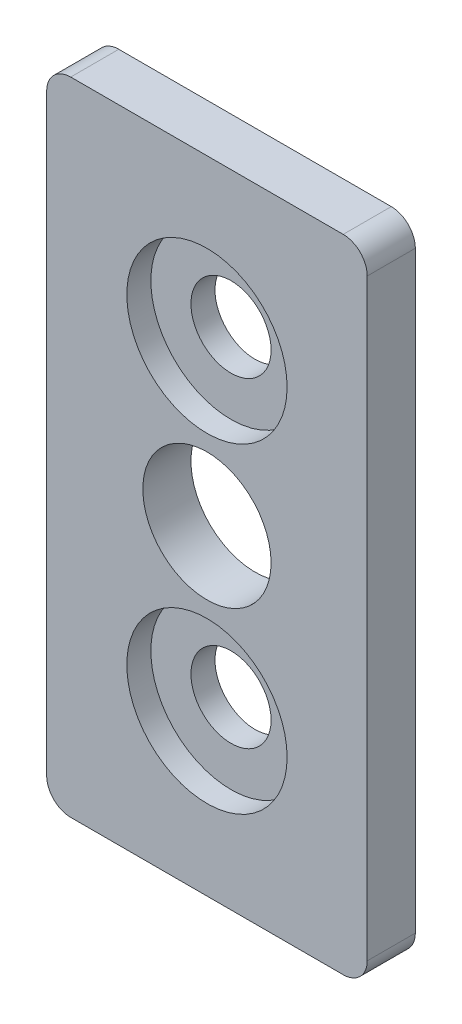
ISO-10303-21;
HEADER;
FILE_DESCRIPTION(('STEP AP214'),'2;1');
FILE_NAME('part.step','',(''),(''),'','','');
FILE_SCHEMA(('AUTOMOTIVE_DESIGN { 1 0 10303 214 1 1 1 1 }'));
ENDSEC;
DATA;
#1=APPLICATION_CONTEXT('core data for automotive mechanical design processes');
#2=APPLICATION_PROTOCOL_DEFINITION('international standard','automotive_design',2000,#1);
#3=PRODUCT_CONTEXT('',#1,'mechanical');
#4=PRODUCT('Part','Part','',(#3));
#5=PRODUCT_RELATED_PRODUCT_CATEGORY('part','',(#4));
#6=PRODUCT_DEFINITION_FORMATION('','',#4);
#7=PRODUCT_DEFINITION_CONTEXT('part definition',#1,'design');
#8=PRODUCT_DEFINITION('design','',#6,#7);
#9=PRODUCT_DEFINITION_SHAPE('','',#8);
#10=(LENGTH_UNIT() NAMED_UNIT(*) SI_UNIT(.MILLI.,.METRE.));
#11=(NAMED_UNIT(*) PLANE_ANGLE_UNIT() SI_UNIT($,.RADIAN.));
#12=(NAMED_UNIT(*) SI_UNIT($,.STERADIAN.) SOLID_ANGLE_UNIT());
#13=UNCERTAINTY_MEASURE_WITH_UNIT(LENGTH_MEASURE(1.E-05),#10,'distance_accuracy_value','');
#14=(GEOMETRIC_REPRESENTATION_CONTEXT(3) GLOBAL_UNCERTAINTY_ASSIGNED_CONTEXT((#13)) GLOBAL_UNIT_ASSIGNED_CONTEXT((#10,
#11,#12)) REPRESENTATION_CONTEXT('',''));
#15=CARTESIAN_POINT('',(0.,0.,0.));
#16=DIRECTION('',(0.,0.,1.));
#17=DIRECTION('',(1.,0.,0.));
#18=AXIS2_PLACEMENT_3D('',#15,#16,#17);
#19=CARTESIAN_POINT('',(0.,10.,3.));
#20=DIRECTION('',(0.,0.,-1.));
#21=DIRECTION('',(-1.,0.,0.));
#22=AXIS2_PLACEMENT_3D('',#19,#20,#21);
#23=CYLINDRICAL_SURFACE('',#22,2.5);
#24=CARTESIAN_POINT('',(0.,10.,0.));
#25=DIRECTION('',(0.,0.,1.));
#26=DIRECTION('',(1.,0.,0.));
#27=AXIS2_PLACEMENT_3D('',#24,#25,#26);
#28=CIRCLE('',#27,2.5);
#29=CARTESIAN_POINT('',(2.5,10.,0.));
#30=VERTEX_POINT('',#29);
#31=EDGE_CURVE('E138',#30,#30,#28,.T.);
#32=ORIENTED_EDGE('',*,*,#31,.F.);
#33=EDGE_LOOP('',(#32));
#34=FACE_BOUND('',#33,.T.);
#35=CARTESIAN_POINT('',(0.,10.,1.5));
#36=DIRECTION('',(0.,0.,1.));
#37=DIRECTION('',(1.,0.,0.));
#38=AXIS2_PLACEMENT_3D('',#35,#36,#37);
#39=CIRCLE('',#38,2.5);
#40=CARTESIAN_POINT('',(2.5,10.,1.5));
#41=VERTEX_POINT('',#40);
#42=EDGE_CURVE('E140',#41,#41,#39,.T.);
#43=ORIENTED_EDGE('',*,*,#42,.T.);
#44=EDGE_LOOP('',(#43));
#45=FACE_BOUND('',#44,.T.);
#46=ADVANCED_FACE('F33',(#34,#45),#23,.F.);
#47=CARTESIAN_POINT('',(0.,-9.99999999999998,3.));
#48=DIRECTION('',(0.,0.,-1.));
#49=DIRECTION('',(-1.,0.,0.));
#50=AXIS2_PLACEMENT_3D('',#47,#48,#49);
#51=CYLINDRICAL_SURFACE('',#50,2.5);
#52=CARTESIAN_POINT('',(0.,-9.99999999999998,0.));
#53=DIRECTION('',(0.,0.,1.));
#54=DIRECTION('',(1.,0.,0.));
#55=AXIS2_PLACEMENT_3D('',#52,#53,#54);
#56=CIRCLE('',#55,2.5);
#57=CARTESIAN_POINT('',(2.5,-9.99999999999998,0.));
#58=VERTEX_POINT('',#57);
#59=EDGE_CURVE('E174',#58,#58,#56,.T.);
#60=ORIENTED_EDGE('',*,*,#59,.F.);
#61=EDGE_LOOP('',(#60));
#62=FACE_BOUND('',#61,.T.);
#63=CARTESIAN_POINT('',(0.,-9.99999999999998,1.5));
#64=DIRECTION('',(0.,0.,1.));
#65=DIRECTION('',(1.,0.,0.));
#66=AXIS2_PLACEMENT_3D('',#63,#64,#65);
#67=CIRCLE('',#66,2.5);
#68=CARTESIAN_POINT('',(2.5,-9.99999999999998,1.5));
#69=VERTEX_POINT('',#68);
#70=EDGE_CURVE('E135',#69,#69,#67,.T.);
#71=ORIENTED_EDGE('',*,*,#70,.T.);
#72=EDGE_LOOP('',(#71));
#73=FACE_BOUND('',#72,.T.);
#74=ADVANCED_FACE('F214',(#62,#73),#51,.F.);
#75=CARTESIAN_POINT('',(0.,0.,3.));
#76=DIRECTION('',(0.,0.,1.));
#77=DIRECTION('',(1.,0.,0.));
#78=AXIS2_PLACEMENT_3D('',#75,#76,#77);
#79=PLANE('',#78);
#80=CARTESIAN_POINT('',(0.,10.,3.));
#81=DIRECTION('',(0.,0.,1.));
#82=DIRECTION('',(1.,0.,0.));
#83=AXIS2_PLACEMENT_3D('',#80,#81,#82);
#84=CIRCLE('',#83,5.);
#85=CARTESIAN_POINT('',(5.,10.,3.));
#86=VERTEX_POINT('',#85);
#87=EDGE_CURVE('E196',#86,#86,#84,.T.);
#88=ORIENTED_EDGE('',*,*,#87,.F.);
#89=EDGE_LOOP('',(#88));
#90=FACE_BOUND('',#89,.T.);
#91=CARTESIAN_POINT('',(0.,-9.99999999999998,3.));
#92=DIRECTION('',(0.,0.,1.));
#93=DIRECTION('',(1.,0.,0.));
#94=AXIS2_PLACEMENT_3D('',#91,#92,#93);
#95=CIRCLE('',#94,5.);
#96=CARTESIAN_POINT('',(5.,-9.99999999999998,3.));
#97=VERTEX_POINT('',#96);
#98=EDGE_CURVE('E143',#97,#97,#95,.T.);
#99=ORIENTED_EDGE('',*,*,#98,.F.);
#100=EDGE_LOOP('',(#99));
#101=FACE_BOUND('',#100,.T.);
#102=CARTESIAN_POINT('',(0.,0.,3.));
#103=DIRECTION('',(0.,0.,1.));
#104=DIRECTION('',(1.,0.,0.));
#105=AXIS2_PLACEMENT_3D('',#102,#103,#104);
#106=CIRCLE('',#105,4.);
#107=CARTESIAN_POINT('',(4.,0.,3.));
#108=VERTEX_POINT('',#107);
#109=EDGE_CURVE('E177',#108,#108,#106,.T.);
#110=ORIENTED_EDGE('',*,*,#109,.F.);
#111=EDGE_LOOP('',(#110));
#112=FACE_BOUND('',#111,.T.);
#113=DIRECTION('',(0.,1.,0.));
#114=VECTOR('',#113,1.);
#115=CARTESIAN_POINT('',(10.,-20.,3.));
#116=LINE('',#115,#114);
#117=CARTESIAN_POINT('',(10.,-18.5,3.));
#118=VERTEX_POINT('',#117);
#119=CARTESIAN_POINT('',(10.,18.5,3.));
#120=VERTEX_POINT('',#119);
#121=EDGE_CURVE('E181',#118,#120,#116,.T.);
#122=ORIENTED_EDGE('',*,*,#121,.T.);
#123=CARTESIAN_POINT('',(8.5,18.5,3.));
#124=DIRECTION('',(0.,0.,1.));
#125=DIRECTION('',(1.,0.,0.));
#126=AXIS2_PLACEMENT_3D('',#123,#124,#125);
#127=CIRCLE('',#126,1.5);
#128=CARTESIAN_POINT('',(8.5,20.,3.));
#129=VERTEX_POINT('',#128);
#130=EDGE_CURVE('E158',#120,#129,#127,.T.);
#131=ORIENTED_EDGE('',*,*,#130,.T.);
#132=DIRECTION('',(-1.,0.,0.));
#133=VECTOR('',#132,1.);
#134=CARTESIAN_POINT('',(10.,20.,3.));
#135=LINE('',#134,#133);
#136=CARTESIAN_POINT('',(-8.5,20.,3.));
#137=VERTEX_POINT('',#136);
#138=EDGE_CURVE('E119',#129,#137,#135,.T.);
#139=ORIENTED_EDGE('',*,*,#138,.T.);
#140=CARTESIAN_POINT('',(-8.5,18.5,3.));
#141=DIRECTION('',(0.,0.,1.));
#142=DIRECTION('',(1.,0.,0.));
#143=AXIS2_PLACEMENT_3D('',#140,#141,#142);
#144=CIRCLE('',#143,1.5);
#145=CARTESIAN_POINT('',(-10.,18.5,3.));
#146=VERTEX_POINT('',#145);
#147=EDGE_CURVE('E153',#137,#146,#144,.T.);
#148=ORIENTED_EDGE('',*,*,#147,.T.);
#149=DIRECTION('',(0.,-1.,0.));
#150=VECTOR('',#149,1.);
#151=CARTESIAN_POINT('',(-10.,-20.,3.));
#152=LINE('',#151,#150);
#153=CARTESIAN_POINT('',(-10.,-18.5,3.));
#154=VERTEX_POINT('',#153);
#155=EDGE_CURVE('E126',#146,#154,#152,.T.);
#156=ORIENTED_EDGE('',*,*,#155,.T.);
#157=CARTESIAN_POINT('',(-8.5,-18.5,3.));
#158=DIRECTION('',(0.,0.,1.));
#159=DIRECTION('',(1.,0.,0.));
#160=AXIS2_PLACEMENT_3D('',#157,#158,#159);
#161=CIRCLE('',#160,1.5);
#162=CARTESIAN_POINT('',(-8.5,-20.,3.));
#163=VERTEX_POINT('',#162);
#164=EDGE_CURVE('E55',#154,#163,#161,.T.);
#165=ORIENTED_EDGE('',*,*,#164,.T.);
#166=DIRECTION('',(1.,0.,0.));
#167=VECTOR('',#166,1.);
#168=CARTESIAN_POINT('',(10.,-20.,3.));
#169=LINE('',#168,#167);
#170=CARTESIAN_POINT('',(8.5,-20.,3.));
#171=VERTEX_POINT('',#170);
#172=EDGE_CURVE('E129',#163,#171,#169,.T.);
#173=ORIENTED_EDGE('',*,*,#172,.T.);
#174=CARTESIAN_POINT('',(8.5,-18.5,3.));
#175=DIRECTION('',(0.,0.,1.));
#176=DIRECTION('',(1.,0.,0.));
#177=AXIS2_PLACEMENT_3D('',#174,#175,#176);
#178=CIRCLE('',#177,1.5);
#179=EDGE_CURVE('E156',#171,#118,#178,.T.);
#180=ORIENTED_EDGE('',*,*,#179,.T.);
#181=EDGE_LOOP('',(#122,#131,#139,#148,#156,#165,#173,#180));
#182=FACE_BOUND('',#181,.T.);
#183=ADVANCED_FACE('F211',(#90,#101,#112,#182),#79,.T.);
#184=CARTESIAN_POINT('',(0.,0.,0.));
#185=DIRECTION('',(0.,0.,1.));
#186=DIRECTION('',(1.,0.,0.));
#187=AXIS2_PLACEMENT_3D('',#184,#185,#186);
#188=PLANE('',#187);
#189=DIRECTION('',(-1.,0.,0.));
#190=VECTOR('',#189,1.);
#191=CARTESIAN_POINT('',(10.,20.,0.));
#192=LINE('',#191,#190);
#193=CARTESIAN_POINT('',(8.5,20.,0.));
#194=VERTEX_POINT('',#193);
#195=CARTESIAN_POINT('',(-8.5,20.,0.));
#196=VERTEX_POINT('',#195);
#197=EDGE_CURVE('E116',#194,#196,#192,.T.);
#198=ORIENTED_EDGE('',*,*,#197,.F.);
#199=CARTESIAN_POINT('',(8.5,18.5,0.));
#200=DIRECTION('',(0.,0.,1.));
#201=DIRECTION('',(1.,0.,0.));
#202=AXIS2_PLACEMENT_3D('',#199,#200,#201);
#203=CIRCLE('',#202,1.5);
#204=CARTESIAN_POINT('',(10.,18.5,0.));
#205=VERTEX_POINT('',#204);
#206=EDGE_CURVE('E99',#194,#205,#203,.F.);
#207=ORIENTED_EDGE('',*,*,#206,.T.);
#208=DIRECTION('',(0.,1.,0.));
#209=VECTOR('',#208,1.);
#210=CARTESIAN_POINT('',(10.,-20.,0.));
#211=LINE('',#210,#209);
#212=CARTESIAN_POINT('',(10.,-18.5,0.));
#213=VERTEX_POINT('',#212);
#214=EDGE_CURVE('E127',#213,#205,#211,.T.);
#215=ORIENTED_EDGE('',*,*,#214,.F.);
#216=CARTESIAN_POINT('',(8.5,-18.5,0.));
#217=DIRECTION('',(0.,0.,1.));
#218=DIRECTION('',(1.,0.,0.));
#219=AXIS2_PLACEMENT_3D('',#216,#217,#218);
#220=CIRCLE('',#219,1.5);
#221=CARTESIAN_POINT('',(8.5,-20.,0.));
#222=VERTEX_POINT('',#221);
#223=EDGE_CURVE('E110',#213,#222,#220,.F.);
#224=ORIENTED_EDGE('',*,*,#223,.T.);
#225=DIRECTION('',(1.,0.,0.));
#226=VECTOR('',#225,1.);
#227=CARTESIAN_POINT('',(10.,-20.,0.));
#228=LINE('',#227,#226);
#229=CARTESIAN_POINT('',(-8.5,-20.,0.));
#230=VERTEX_POINT('',#229);
#231=EDGE_CURVE('E131',#230,#222,#228,.T.);
#232=ORIENTED_EDGE('',*,*,#231,.F.);
#233=CARTESIAN_POINT('',(-8.5,-18.5,0.));
#234=DIRECTION('',(0.,0.,1.));
#235=DIRECTION('',(1.,0.,0.));
#236=AXIS2_PLACEMENT_3D('',#233,#234,#235);
#237=CIRCLE('',#236,1.5);
#238=CARTESIAN_POINT('',(-10.,-18.5,0.));
#239=VERTEX_POINT('',#238);
#240=EDGE_CURVE('E147',#230,#239,#237,.F.);
#241=ORIENTED_EDGE('',*,*,#240,.T.);
#242=DIRECTION('',(0.,-1.,0.));
#243=VECTOR('',#242,1.);
#244=CARTESIAN_POINT('',(-10.,-20.,0.));
#245=LINE('',#244,#243);
#246=CARTESIAN_POINT('',(-10.,18.5,0.));
#247=VERTEX_POINT('',#246);
#248=EDGE_CURVE('E169',#247,#239,#245,.T.);
#249=ORIENTED_EDGE('',*,*,#248,.F.);
#250=CARTESIAN_POINT('',(-8.5,18.5,0.));
#251=DIRECTION('',(0.,0.,1.));
#252=DIRECTION('',(1.,0.,0.));
#253=AXIS2_PLACEMENT_3D('',#250,#251,#252);
#254=CIRCLE('',#253,1.5);
#255=EDGE_CURVE('E120',#247,#196,#254,.F.);
#256=ORIENTED_EDGE('',*,*,#255,.T.);
#257=EDGE_LOOP('',(#198,#207,#215,#224,#232,#241,#249,#256));
#258=FACE_BOUND('',#257,.T.);
#259=ORIENTED_EDGE('',*,*,#59,.T.);
#260=EDGE_LOOP('',(#259));
#261=FACE_BOUND('',#260,.T.);
#262=CARTESIAN_POINT('',(0.,0.,0.));
#263=DIRECTION('',(0.,0.,1.));
#264=DIRECTION('',(1.,0.,0.));
#265=AXIS2_PLACEMENT_3D('',#262,#263,#264);
#266=CIRCLE('',#265,4.);
#267=CARTESIAN_POINT('',(4.,0.,0.));
#268=VERTEX_POINT('',#267);
#269=EDGE_CURVE('E185',#268,#268,#266,.T.);
#270=ORIENTED_EDGE('',*,*,#269,.T.);
#271=EDGE_LOOP('',(#270));
#272=FACE_BOUND('',#271,.T.);
#273=ORIENTED_EDGE('',*,*,#31,.T.);
#274=EDGE_LOOP('',(#273));
#275=FACE_BOUND('',#274,.T.);
#276=ADVANCED_FACE('F123',(#258,#261,#272,#275),#188,.F.);
#277=CARTESIAN_POINT('',(-10.,-20.,3.));
#278=DIRECTION('',(1.,0.,0.));
#279=DIRECTION('',(0.,0.,-1.));
#280=AXIS2_PLACEMENT_3D('',#277,#278,#279);
#281=PLANE('',#280);
#282=ORIENTED_EDGE('',*,*,#248,.T.);
#283=DIRECTION('',(0.,0.,-1.));
#284=VECTOR('',#283,1.);
#285=CARTESIAN_POINT('',(-10.,-18.5,3.));
#286=LINE('',#285,#284);
#287=EDGE_CURVE('E11',#239,#154,#286,.F.);
#288=ORIENTED_EDGE('',*,*,#287,.T.);
#289=ORIENTED_EDGE('',*,*,#155,.F.);
#290=DIRECTION('',(0.,0.,-1.));
#291=VECTOR('',#290,1.);
#292=CARTESIAN_POINT('',(-10.,18.5,3.));
#293=LINE('',#292,#291);
#294=EDGE_CURVE('E41',#146,#247,#293,.T.);
#295=ORIENTED_EDGE('',*,*,#294,.T.);
#296=EDGE_LOOP('',(#282,#288,#289,#295));
#297=FACE_BOUND('',#296,.T.);
#298=ADVANCED_FACE('F168',(#297),#281,.F.);
#299=CARTESIAN_POINT('',(10.,-20.,3.));
#300=DIRECTION('',(0.,1.,0.));
#301=DIRECTION('',(-1.,0.,0.));
#302=AXIS2_PLACEMENT_3D('',#299,#300,#301);
#303=PLANE('',#302);
#304=ORIENTED_EDGE('',*,*,#231,.T.);
#305=DIRECTION('',(0.,0.,-1.));
#306=VECTOR('',#305,1.);
#307=CARTESIAN_POINT('',(8.5,-20.,3.));
#308=LINE('',#307,#306);
#309=EDGE_CURVE('E48',#222,#171,#308,.F.);
#310=ORIENTED_EDGE('',*,*,#309,.T.);
#311=ORIENTED_EDGE('',*,*,#172,.F.);
#312=DIRECTION('',(0.,0.,-1.));
#313=VECTOR('',#312,1.);
#314=CARTESIAN_POINT('',(-8.5,-20.,3.));
#315=LINE('',#314,#313);
#316=EDGE_CURVE('E160',#163,#230,#315,.T.);
#317=ORIENTED_EDGE('',*,*,#316,.T.);
#318=EDGE_LOOP('',(#304,#310,#311,#317));
#319=FACE_BOUND('',#318,.T.);
#320=ADVANCED_FACE('F226',(#319),#303,.F.);
#321=CARTESIAN_POINT('',(10.,-20.,3.));
#322=DIRECTION('',(-1.,0.,0.));
#323=DIRECTION('',(0.,0.,1.));
#324=AXIS2_PLACEMENT_3D('',#321,#322,#323);
#325=PLANE('',#324);
#326=ORIENTED_EDGE('',*,*,#214,.T.);
#327=DIRECTION('',(0.,0.,-1.));
#328=VECTOR('',#327,1.);
#329=CARTESIAN_POINT('',(10.,18.5,3.));
#330=LINE('',#329,#328);
#331=EDGE_CURVE('E104',#205,#120,#330,.F.);
#332=ORIENTED_EDGE('',*,*,#331,.T.);
#333=ORIENTED_EDGE('',*,*,#121,.F.);
#334=DIRECTION('',(0.,0.,-1.));
#335=VECTOR('',#334,1.);
#336=CARTESIAN_POINT('',(10.,-18.5,3.));
#337=LINE('',#336,#335);
#338=EDGE_CURVE('E109',#118,#213,#337,.T.);
#339=ORIENTED_EDGE('',*,*,#338,.T.);
#340=EDGE_LOOP('',(#326,#332,#333,#339));
#341=FACE_BOUND('',#340,.T.);
#342=ADVANCED_FACE('F223',(#341),#325,.F.);
#343=CARTESIAN_POINT('',(10.,20.,3.));
#344=DIRECTION('',(0.,-1.,0.));
#345=DIRECTION('',(1.,0.,0.));
#346=AXIS2_PLACEMENT_3D('',#343,#344,#345);
#347=PLANE('',#346);
#348=ORIENTED_EDGE('',*,*,#138,.F.);
#349=DIRECTION('',(0.,0.,-1.));
#350=VECTOR('',#349,1.);
#351=CARTESIAN_POINT('',(8.5,20.,3.));
#352=LINE('',#351,#350);
#353=EDGE_CURVE('E103',#129,#194,#352,.T.);
#354=ORIENTED_EDGE('',*,*,#353,.T.);
#355=ORIENTED_EDGE('',*,*,#197,.T.);
#356=DIRECTION('',(0.,0.,-1.));
#357=VECTOR('',#356,1.);
#358=CARTESIAN_POINT('',(-8.5,20.,3.));
#359=LINE('',#358,#357);
#360=EDGE_CURVE('E121',#196,#137,#359,.F.);
#361=ORIENTED_EDGE('',*,*,#360,.T.);
#362=EDGE_LOOP('',(#348,#354,#355,#361));
#363=FACE_BOUND('',#362,.T.);
#364=ADVANCED_FACE('F115',(#363),#347,.F.);
#365=CARTESIAN_POINT('',(0.,0.,3.));
#366=DIRECTION('',(0.,0.,-1.));
#367=DIRECTION('',(-1.,0.,0.));
#368=AXIS2_PLACEMENT_3D('',#365,#366,#367);
#369=CYLINDRICAL_SURFACE('',#368,4.);
#370=ORIENTED_EDGE('',*,*,#109,.T.);
#371=EDGE_LOOP('',(#370));
#372=FACE_BOUND('',#371,.T.);
#373=ORIENTED_EDGE('',*,*,#269,.F.);
#374=EDGE_LOOP('',(#373));
#375=FACE_BOUND('',#374,.T.);
#376=ADVANCED_FACE('F248',(#372,#375),#369,.F.);
#377=CARTESIAN_POINT('',(0.,-9.99999999999998,1.5));
#378=DIRECTION('',(0.,0.,1.));
#379=DIRECTION('',(1.,0.,0.));
#380=AXIS2_PLACEMENT_3D('',#377,#378,#379);
#381=CYLINDRICAL_SURFACE('',#380,5.);
#382=CARTESIAN_POINT('',(0.,-9.99999999999998,1.5));
#383=DIRECTION('',(0.,0.,1.));
#384=DIRECTION('',(1.,0.,0.));
#385=AXIS2_PLACEMENT_3D('',#382,#383,#384);
#386=CIRCLE('',#385,5.);
#387=CARTESIAN_POINT('',(5.,-9.99999999999998,1.5));
#388=VERTEX_POINT('',#387);
#389=EDGE_CURVE('E139',#388,#388,#386,.T.);
#390=ORIENTED_EDGE('',*,*,#389,.F.);
#391=EDGE_LOOP('',(#390));
#392=FACE_BOUND('',#391,.T.);
#393=ORIENTED_EDGE('',*,*,#98,.T.);
#394=EDGE_LOOP('',(#393));
#395=FACE_BOUND('',#394,.T.);
#396=ADVANCED_FACE('F246',(#392,#395),#381,.F.);
#397=CARTESIAN_POINT('',(0.,-9.99999999999998,1.5));
#398=DIRECTION('',(0.,0.,1.));
#399=DIRECTION('',(1.,0.,0.));
#400=AXIS2_PLACEMENT_3D('',#397,#398,#399);
#401=PLANE('',#400);
#402=ORIENTED_EDGE('',*,*,#70,.F.);
#403=EDGE_LOOP('',(#402));
#404=FACE_BOUND('',#403,.T.);
#405=ORIENTED_EDGE('',*,*,#389,.T.);
#406=EDGE_LOOP('',(#405));
#407=FACE_BOUND('',#406,.T.);
#408=ADVANCED_FACE('F207',(#404,#407),#401,.T.);
#409=CARTESIAN_POINT('',(0.,10.,1.5));
#410=DIRECTION('',(0.,0.,1.));
#411=DIRECTION('',(1.,0.,0.));
#412=AXIS2_PLACEMENT_3D('',#409,#410,#411);
#413=CYLINDRICAL_SURFACE('',#412,5.);
#414=CARTESIAN_POINT('',(0.,10.,1.5));
#415=DIRECTION('',(0.,0.,1.));
#416=DIRECTION('',(1.,0.,0.));
#417=AXIS2_PLACEMENT_3D('',#414,#415,#416);
#418=CIRCLE('',#417,5.);
#419=CARTESIAN_POINT('',(5.,10.,1.5));
#420=VERTEX_POINT('',#419);
#421=EDGE_CURVE('E144',#420,#420,#418,.T.);
#422=ORIENTED_EDGE('',*,*,#421,.F.);
#423=EDGE_LOOP('',(#422));
#424=FACE_BOUND('',#423,.T.);
#425=ORIENTED_EDGE('',*,*,#87,.T.);
#426=EDGE_LOOP('',(#425));
#427=FACE_BOUND('',#426,.T.);
#428=ADVANCED_FACE('F204',(#424,#427),#413,.F.);
#429=CARTESIAN_POINT('',(0.,10.,1.5));
#430=DIRECTION('',(0.,0.,1.));
#431=DIRECTION('',(1.,0.,0.));
#432=AXIS2_PLACEMENT_3D('',#429,#430,#431);
#433=PLANE('',#432);
#434=ORIENTED_EDGE('',*,*,#42,.F.);
#435=EDGE_LOOP('',(#434));
#436=FACE_BOUND('',#435,.T.);
#437=ORIENTED_EDGE('',*,*,#421,.T.);
#438=EDGE_LOOP('',(#437));
#439=FACE_BOUND('',#438,.T.);
#440=ADVANCED_FACE('F202',(#436,#439),#433,.T.);
#441=CARTESIAN_POINT('',(8.5,18.5,3.));
#442=DIRECTION('',(0.,0.,-1.));
#443=DIRECTION('',(-1.,0.,0.));
#444=AXIS2_PLACEMENT_3D('',#441,#442,#443);
#445=CYLINDRICAL_SURFACE('',#444,1.5);
#446=ORIENTED_EDGE('',*,*,#130,.F.);
#447=ORIENTED_EDGE('',*,*,#331,.F.);
#448=ORIENTED_EDGE('',*,*,#206,.F.);
#449=ORIENTED_EDGE('',*,*,#353,.F.);
#450=EDGE_LOOP('',(#446,#447,#448,#449));
#451=FACE_BOUND('',#450,.T.);
#452=ADVANCED_FACE('F102',(#451),#445,.T.);
#453=CARTESIAN_POINT('',(8.5,-18.5,3.));
#454=DIRECTION('',(0.,0.,-1.));
#455=DIRECTION('',(-1.,0.,0.));
#456=AXIS2_PLACEMENT_3D('',#453,#454,#455);
#457=CYLINDRICAL_SURFACE('',#456,1.5);
#458=ORIENTED_EDGE('',*,*,#179,.F.);
#459=ORIENTED_EDGE('',*,*,#309,.F.);
#460=ORIENTED_EDGE('',*,*,#223,.F.);
#461=ORIENTED_EDGE('',*,*,#338,.F.);
#462=EDGE_LOOP('',(#458,#459,#460,#461));
#463=FACE_BOUND('',#462,.T.);
#464=ADVANCED_FACE('F225',(#463),#457,.T.);
#465=CARTESIAN_POINT('',(-8.5,-18.5,3.));
#466=DIRECTION('',(0.,0.,-1.));
#467=DIRECTION('',(-1.,0.,0.));
#468=AXIS2_PLACEMENT_3D('',#465,#466,#467);
#469=CYLINDRICAL_SURFACE('',#468,1.5);
#470=ORIENTED_EDGE('',*,*,#164,.F.);
#471=ORIENTED_EDGE('',*,*,#287,.F.);
#472=ORIENTED_EDGE('',*,*,#240,.F.);
#473=ORIENTED_EDGE('',*,*,#316,.F.);
#474=EDGE_LOOP('',(#470,#471,#472,#473));
#475=FACE_BOUND('',#474,.T.);
#476=ADVANCED_FACE('F229',(#475),#469,.T.);
#477=CARTESIAN_POINT('',(-8.5,18.5,3.));
#478=DIRECTION('',(0.,0.,-1.));
#479=DIRECTION('',(-1.,0.,0.));
#480=AXIS2_PLACEMENT_3D('',#477,#478,#479);
#481=CYLINDRICAL_SURFACE('',#480,1.5);
#482=ORIENTED_EDGE('',*,*,#147,.F.);
#483=ORIENTED_EDGE('',*,*,#360,.F.);
#484=ORIENTED_EDGE('',*,*,#255,.F.);
#485=ORIENTED_EDGE('',*,*,#294,.F.);
#486=EDGE_LOOP('',(#482,#483,#484,#485));
#487=FACE_BOUND('',#486,.T.);
#488=ADVANCED_FACE('F35',(#487),#481,.T.);
#489=CLOSED_SHELL('',(#46,#74,#183,#276,#298,#320,#342,#364,#376,#396,#408,#428,#440,#452,#464,
#476,#488));
#490=MANIFOLD_SOLID_BREP('B2',#489);
#491=ADVANCED_BREP_SHAPE_REPRESENTATION('',(#18,#490),#14);
#492=SHAPE_DEFINITION_REPRESENTATION(#9,#491);
ENDSEC;
END-ISO-10303-21;
